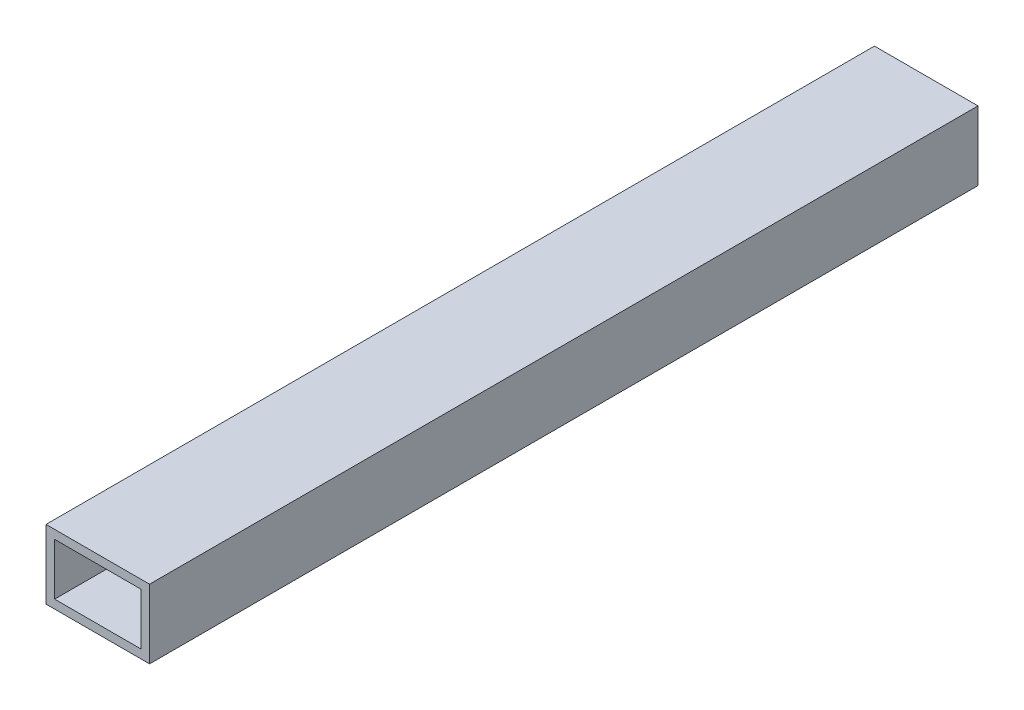
ISO-10303-21;
HEADER;
FILE_DESCRIPTION(('STEP AP214'),'2;1');
FILE_NAME('part.step','',(''),(''),'','','');
FILE_SCHEMA(('AUTOMOTIVE_DESIGN { 1 0 10303 214 1 1 1 1 }'));
ENDSEC;
DATA;
#1=APPLICATION_CONTEXT('core data for automotive mechanical design processes');
#2=APPLICATION_PROTOCOL_DEFINITION('international standard','automotive_design',2000,#1);
#3=PRODUCT_CONTEXT('',#1,'mechanical');
#4=PRODUCT('Part','Part','',(#3));
#5=PRODUCT_RELATED_PRODUCT_CATEGORY('part','',(#4));
#6=PRODUCT_DEFINITION_FORMATION('','',#4);
#7=PRODUCT_DEFINITION_CONTEXT('part definition',#1,'design');
#8=PRODUCT_DEFINITION('design','',#6,#7);
#9=PRODUCT_DEFINITION_SHAPE('','',#8);
#10=(LENGTH_UNIT() NAMED_UNIT(*) SI_UNIT(.MILLI.,.METRE.));
#11=(NAMED_UNIT(*) PLANE_ANGLE_UNIT() SI_UNIT($,.RADIAN.));
#12=(NAMED_UNIT(*) SI_UNIT($,.STERADIAN.) SOLID_ANGLE_UNIT());
#13=UNCERTAINTY_MEASURE_WITH_UNIT(LENGTH_MEASURE(1.E-05),#10,'distance_accuracy_value','');
#14=(GEOMETRIC_REPRESENTATION_CONTEXT(3) GLOBAL_UNCERTAINTY_ASSIGNED_CONTEXT((#13)) GLOBAL_UNIT_ASSIGNED_CONTEXT((#10,
#11,#12)) REPRESENTATION_CONTEXT('',''));
#15=CARTESIAN_POINT('',(0.,0.,0.));
#16=DIRECTION('',(0.,0.,1.));
#17=DIRECTION('',(1.,0.,0.));
#18=AXIS2_PLACEMENT_3D('',#15,#16,#17);
#19=CARTESIAN_POINT('',(19.05,12.7,304.8));
#20=DIRECTION('',(-1.,0.,0.));
#21=DIRECTION('',(0.,-1.,0.));
#22=AXIS2_PLACEMENT_3D('',#19,#20,#21);
#23=PLANE('',#22);
#24=DIRECTION('',(0.,1.,0.));
#25=VECTOR('',#24,1.);
#26=CARTESIAN_POINT('',(19.05,12.7,0.));
#27=LINE('',#26,#25);
#28=CARTESIAN_POINT('',(19.05,-12.7,0.));
#29=VERTEX_POINT('',#28);
#30=CARTESIAN_POINT('',(19.05,12.7,0.));
#31=VERTEX_POINT('',#30);
#32=EDGE_CURVE('E145',#29,#31,#27,.T.);
#33=ORIENTED_EDGE('',*,*,#32,.T.);
#34=DIRECTION('',(0.,0.,-1.));
#35=VECTOR('',#34,1.);
#36=CARTESIAN_POINT('',(19.05,12.7,304.8));
#37=LINE('',#36,#35);
#38=CARTESIAN_POINT('',(19.05,12.7,304.8));
#39=VERTEX_POINT('',#38);
#40=EDGE_CURVE('E11',#39,#31,#37,.T.);
#41=ORIENTED_EDGE('',*,*,#40,.F.);
#42=DIRECTION('',(0.,1.,0.));
#43=VECTOR('',#42,1.);
#44=CARTESIAN_POINT('',(19.05,12.7,304.8));
#45=LINE('',#44,#43);
#46=CARTESIAN_POINT('',(19.05,-12.7,304.8));
#47=VERTEX_POINT('',#46);
#48=EDGE_CURVE('E134',#47,#39,#45,.T.);
#49=ORIENTED_EDGE('',*,*,#48,.F.);
#50=DIRECTION('',(0.,0.,-1.));
#51=VECTOR('',#50,1.);
#52=CARTESIAN_POINT('',(19.05,-12.7,304.8));
#53=LINE('',#52,#51);
#54=EDGE_CURVE('E144',#47,#29,#53,.T.);
#55=ORIENTED_EDGE('',*,*,#54,.T.);
#56=EDGE_LOOP('',(#33,#41,#49,#55));
#57=FACE_BOUND('',#56,.T.);
#58=ADVANCED_FACE('F37',(#57),#23,.F.);
#59=CARTESIAN_POINT('',(-19.05,12.7,304.8));
#60=DIRECTION('',(0.,-1.,0.));
#61=DIRECTION('',(0.,0.,-1.));
#62=AXIS2_PLACEMENT_3D('',#59,#60,#61);
#63=PLANE('',#62);
#64=DIRECTION('',(-1.,0.,0.));
#65=VECTOR('',#64,1.);
#66=CARTESIAN_POINT('',(-19.05,12.7,0.));
#67=LINE('',#66,#65);
#68=CARTESIAN_POINT('',(-19.05,12.7,0.));
#69=VERTEX_POINT('',#68);
#70=EDGE_CURVE('E148',#31,#69,#67,.T.);
#71=ORIENTED_EDGE('',*,*,#70,.T.);
#72=DIRECTION('',(0.,0.,-1.));
#73=VECTOR('',#72,1.);
#74=CARTESIAN_POINT('',(-19.05,12.7,304.8));
#75=LINE('',#74,#73);
#76=CARTESIAN_POINT('',(-19.05,12.7,304.8));
#77=VERTEX_POINT('',#76);
#78=EDGE_CURVE('E44',#77,#69,#75,.T.);
#79=ORIENTED_EDGE('',*,*,#78,.F.);
#80=DIRECTION('',(-1.,0.,0.));
#81=VECTOR('',#80,1.);
#82=CARTESIAN_POINT('',(-19.05,12.7,304.8));
#83=LINE('',#82,#81);
#84=EDGE_CURVE('E137',#39,#77,#83,.T.);
#85=ORIENTED_EDGE('',*,*,#84,.F.);
#86=ORIENTED_EDGE('',*,*,#40,.T.);
#87=EDGE_LOOP('',(#71,#79,#85,#86));
#88=FACE_BOUND('',#87,.T.);
#89=ADVANCED_FACE('F176',(#88),#63,.F.);
#90=CARTESIAN_POINT('',(-19.05,12.7,304.8));
#91=DIRECTION('',(1.,0.,0.));
#92=DIRECTION('',(0.,1.,0.));
#93=AXIS2_PLACEMENT_3D('',#90,#91,#92);
#94=PLANE('',#93);
#95=DIRECTION('',(0.,-1.,0.));
#96=VECTOR('',#95,1.);
#97=CARTESIAN_POINT('',(-19.05,12.7,0.));
#98=LINE('',#97,#96);
#99=CARTESIAN_POINT('',(-19.05,-12.7,0.));
#100=VERTEX_POINT('',#99);
#101=EDGE_CURVE('E150',#69,#100,#98,.T.);
#102=ORIENTED_EDGE('',*,*,#101,.T.);
#103=DIRECTION('',(0.,0.,-1.));
#104=VECTOR('',#103,1.);
#105=CARTESIAN_POINT('',(-19.05,-12.7,304.8));
#106=LINE('',#105,#104);
#107=CARTESIAN_POINT('',(-19.05,-12.7,304.8));
#108=VERTEX_POINT('',#107);
#109=EDGE_CURVE('E155',#108,#100,#106,.T.);
#110=ORIENTED_EDGE('',*,*,#109,.F.);
#111=DIRECTION('',(0.,-1.,0.));
#112=VECTOR('',#111,1.);
#113=CARTESIAN_POINT('',(-19.05,12.7,304.8));
#114=LINE('',#113,#112);
#115=EDGE_CURVE('E140',#77,#108,#114,.T.);
#116=ORIENTED_EDGE('',*,*,#115,.F.);
#117=ORIENTED_EDGE('',*,*,#78,.T.);
#118=EDGE_LOOP('',(#102,#110,#116,#117));
#119=FACE_BOUND('',#118,.T.);
#120=ADVANCED_FACE('F162',(#119),#94,.F.);
#121=CARTESIAN_POINT('',(-19.05,-12.7,304.8));
#122=DIRECTION('',(0.,1.,0.));
#123=DIRECTION('',(0.,0.,1.));
#124=AXIS2_PLACEMENT_3D('',#121,#122,#123);
#125=PLANE('',#124);
#126=DIRECTION('',(1.,0.,0.));
#127=VECTOR('',#126,1.);
#128=CARTESIAN_POINT('',(-19.05,-12.7,0.));
#129=LINE('',#128,#127);
#130=EDGE_CURVE('E138',#100,#29,#129,.T.);
#131=ORIENTED_EDGE('',*,*,#130,.T.);
#132=ORIENTED_EDGE('',*,*,#54,.F.);
#133=DIRECTION('',(1.,0.,0.));
#134=VECTOR('',#133,1.);
#135=CARTESIAN_POINT('',(-19.05,-12.7,304.8));
#136=LINE('',#135,#134);
#137=EDGE_CURVE('E142',#108,#47,#136,.T.);
#138=ORIENTED_EDGE('',*,*,#137,.F.);
#139=ORIENTED_EDGE('',*,*,#109,.T.);
#140=EDGE_LOOP('',(#131,#132,#138,#139));
#141=FACE_BOUND('',#140,.T.);
#142=ADVANCED_FACE('F169',(#141),#125,.F.);
#143=CARTESIAN_POINT('',(0.,0.,304.8));
#144=DIRECTION('',(0.,0.,1.));
#145=DIRECTION('',(1.,0.,0.));
#146=AXIS2_PLACEMENT_3D('',#143,#144,#145);
#147=PLANE('',#146);
#148=DIRECTION('',(0.,1.,0.));
#149=VECTOR('',#148,1.);
#150=CARTESIAN_POINT('',(15.875,12.7,304.8));
#151=LINE('',#150,#149);
#152=CARTESIAN_POINT('',(15.875,-9.525,304.8));
#153=VERTEX_POINT('',#152);
#154=CARTESIAN_POINT('',(15.875,9.525,304.8));
#155=VERTEX_POINT('',#154);
#156=EDGE_CURVE('E122',#153,#155,#151,.T.);
#157=ORIENTED_EDGE('',*,*,#156,.F.);
#158=DIRECTION('',(1.,0.,0.));
#159=VECTOR('',#158,1.);
#160=CARTESIAN_POINT('',(-19.05,-9.525,304.8));
#161=LINE('',#160,#159);
#162=CARTESIAN_POINT('',(-15.875,-9.525,304.8));
#163=VERTEX_POINT('',#162);
#164=EDGE_CURVE('E106',#163,#153,#161,.T.);
#165=ORIENTED_EDGE('',*,*,#164,.F.);
#166=DIRECTION('',(0.,-1.,0.));
#167=VECTOR('',#166,1.);
#168=CARTESIAN_POINT('',(-15.875,12.7,304.8));
#169=LINE('',#168,#167);
#170=CARTESIAN_POINT('',(-15.875,9.525,304.8));
#171=VERTEX_POINT('',#170);
#172=EDGE_CURVE('E131',#171,#163,#169,.T.);
#173=ORIENTED_EDGE('',*,*,#172,.F.);
#174=DIRECTION('',(-1.,0.,0.));
#175=VECTOR('',#174,1.);
#176=CARTESIAN_POINT('',(-19.05,9.525,304.8));
#177=LINE('',#176,#175);
#178=EDGE_CURVE('E124',#155,#171,#177,.T.);
#179=ORIENTED_EDGE('',*,*,#178,.F.);
#180=EDGE_LOOP('',(#157,#165,#173,#179));
#181=FACE_BOUND('',#180,.T.);
#182=ORIENTED_EDGE('',*,*,#48,.T.);
#183=ORIENTED_EDGE('',*,*,#84,.T.);
#184=ORIENTED_EDGE('',*,*,#115,.T.);
#185=ORIENTED_EDGE('',*,*,#137,.T.);
#186=EDGE_LOOP('',(#182,#183,#184,#185));
#187=FACE_BOUND('',#186,.T.);
#188=ADVANCED_FACE('F175',(#181,#187),#147,.T.);
#189=CARTESIAN_POINT('',(0.,0.,0.));
#190=DIRECTION('',(0.,0.,1.));
#191=DIRECTION('',(1.,0.,0.));
#192=AXIS2_PLACEMENT_3D('',#189,#190,#191);
#193=PLANE('',#192);
#194=DIRECTION('',(1.,0.,0.));
#195=VECTOR('',#194,1.);
#196=CARTESIAN_POINT('',(-19.05,-9.525,0.));
#197=LINE('',#196,#195);
#198=CARTESIAN_POINT('',(-15.875,-9.525,0.));
#199=VERTEX_POINT('',#198);
#200=CARTESIAN_POINT('',(15.875,-9.525,0.));
#201=VERTEX_POINT('',#200);
#202=EDGE_CURVE('E104',#199,#201,#197,.T.);
#203=ORIENTED_EDGE('',*,*,#202,.T.);
#204=DIRECTION('',(0.,1.,0.));
#205=VECTOR('',#204,1.);
#206=CARTESIAN_POINT('',(15.875,12.7,0.));
#207=LINE('',#206,#205);
#208=CARTESIAN_POINT('',(15.875,9.525,0.));
#209=VERTEX_POINT('',#208);
#210=EDGE_CURVE('E112',#201,#209,#207,.T.);
#211=ORIENTED_EDGE('',*,*,#210,.T.);
#212=DIRECTION('',(-1.,0.,0.));
#213=VECTOR('',#212,1.);
#214=CARTESIAN_POINT('',(-19.05,9.525,0.));
#215=LINE('',#214,#213);
#216=CARTESIAN_POINT('',(-15.875,9.525,0.));
#217=VERTEX_POINT('',#216);
#218=EDGE_CURVE('E118',#209,#217,#215,.T.);
#219=ORIENTED_EDGE('',*,*,#218,.T.);
#220=DIRECTION('',(0.,-1.,0.));
#221=VECTOR('',#220,1.);
#222=CARTESIAN_POINT('',(-15.875,12.7,0.));
#223=LINE('',#222,#221);
#224=EDGE_CURVE('E58',#217,#199,#223,.T.);
#225=ORIENTED_EDGE('',*,*,#224,.T.);
#226=EDGE_LOOP('',(#203,#211,#219,#225));
#227=FACE_BOUND('',#226,.T.);
#228=ORIENTED_EDGE('',*,*,#32,.F.);
#229=ORIENTED_EDGE('',*,*,#130,.F.);
#230=ORIENTED_EDGE('',*,*,#101,.F.);
#231=ORIENTED_EDGE('',*,*,#70,.F.);
#232=EDGE_LOOP('',(#228,#229,#230,#231));
#233=FACE_BOUND('',#232,.T.);
#234=ADVANCED_FACE('F120',(#227,#233),#193,.F.);
#235=CARTESIAN_POINT('',(15.875,12.7,304.8));
#236=DIRECTION('',(-1.,0.,0.));
#237=DIRECTION('',(0.,-1.,0.));
#238=AXIS2_PLACEMENT_3D('',#235,#236,#237);
#239=PLANE('',#238);
#240=ORIENTED_EDGE('',*,*,#210,.F.);
#241=DIRECTION('',(0.,0.,-1.));
#242=VECTOR('',#241,1.);
#243=CARTESIAN_POINT('',(15.875,-9.525,304.8));
#244=LINE('',#243,#242);
#245=EDGE_CURVE('E100',#153,#201,#244,.T.);
#246=ORIENTED_EDGE('',*,*,#245,.F.);
#247=ORIENTED_EDGE('',*,*,#156,.T.);
#248=DIRECTION('',(0.,0.,-1.));
#249=VECTOR('',#248,1.);
#250=CARTESIAN_POINT('',(15.875,9.525,304.8));
#251=LINE('',#250,#249);
#252=EDGE_CURVE('E115',#155,#209,#251,.T.);
#253=ORIENTED_EDGE('',*,*,#252,.T.);
#254=EDGE_LOOP('',(#240,#246,#247,#253));
#255=FACE_BOUND('',#254,.T.);
#256=ADVANCED_FACE('F113',(#255),#239,.T.);
#257=CARTESIAN_POINT('',(-19.05,9.525,304.8));
#258=DIRECTION('',(0.,-1.,0.));
#259=DIRECTION('',(0.,0.,-1.));
#260=AXIS2_PLACEMENT_3D('',#257,#258,#259);
#261=PLANE('',#260);
#262=ORIENTED_EDGE('',*,*,#218,.F.);
#263=ORIENTED_EDGE('',*,*,#252,.F.);
#264=ORIENTED_EDGE('',*,*,#178,.T.);
#265=DIRECTION('',(0.,0.,-1.));
#266=VECTOR('',#265,1.);
#267=CARTESIAN_POINT('',(-15.875,9.525,304.8));
#268=LINE('',#267,#266);
#269=EDGE_CURVE('E280',#171,#217,#268,.T.);
#270=ORIENTED_EDGE('',*,*,#269,.T.);
#271=EDGE_LOOP('',(#262,#263,#264,#270));
#272=FACE_BOUND('',#271,.T.);
#273=ADVANCED_FACE('F196',(#272),#261,.T.);
#274=CARTESIAN_POINT('',(-15.875,12.7,304.8));
#275=DIRECTION('',(1.,0.,0.));
#276=DIRECTION('',(0.,1.,0.));
#277=AXIS2_PLACEMENT_3D('',#274,#275,#276);
#278=PLANE('',#277);
#279=ORIENTED_EDGE('',*,*,#224,.F.);
#280=ORIENTED_EDGE('',*,*,#269,.F.);
#281=ORIENTED_EDGE('',*,*,#172,.T.);
#282=DIRECTION('',(0.,0.,-1.));
#283=VECTOR('',#282,1.);
#284=CARTESIAN_POINT('',(-15.875,-9.525,304.8));
#285=LINE('',#284,#283);
#286=EDGE_CURVE('E51',#163,#199,#285,.T.);
#287=ORIENTED_EDGE('',*,*,#286,.T.);
#288=EDGE_LOOP('',(#279,#280,#281,#287));
#289=FACE_BOUND('',#288,.T.);
#290=ADVANCED_FACE('F193',(#289),#278,.T.);
#291=CARTESIAN_POINT('',(-19.05,-9.525,304.8));
#292=DIRECTION('',(0.,1.,0.));
#293=DIRECTION('',(0.,0.,1.));
#294=AXIS2_PLACEMENT_3D('',#291,#292,#293);
#295=PLANE('',#294);
#296=ORIENTED_EDGE('',*,*,#202,.F.);
#297=ORIENTED_EDGE('',*,*,#286,.F.);
#298=ORIENTED_EDGE('',*,*,#164,.T.);
#299=ORIENTED_EDGE('',*,*,#245,.T.);
#300=EDGE_LOOP('',(#296,#297,#298,#299));
#301=FACE_BOUND('',#300,.T.);
#302=ADVANCED_FACE('F102',(#301),#295,.T.);
#303=CLOSED_SHELL('',(#58,#89,#120,#142,#188,#234,#256,#273,#290,#302));
#304=MANIFOLD_SOLID_BREP('B2',#303);
#305=ADVANCED_BREP_SHAPE_REPRESENTATION('',(#18,#304),#14);
#306=SHAPE_DEFINITION_REPRESENTATION(#9,#305);
ENDSEC;
END-ISO-10303-21;
